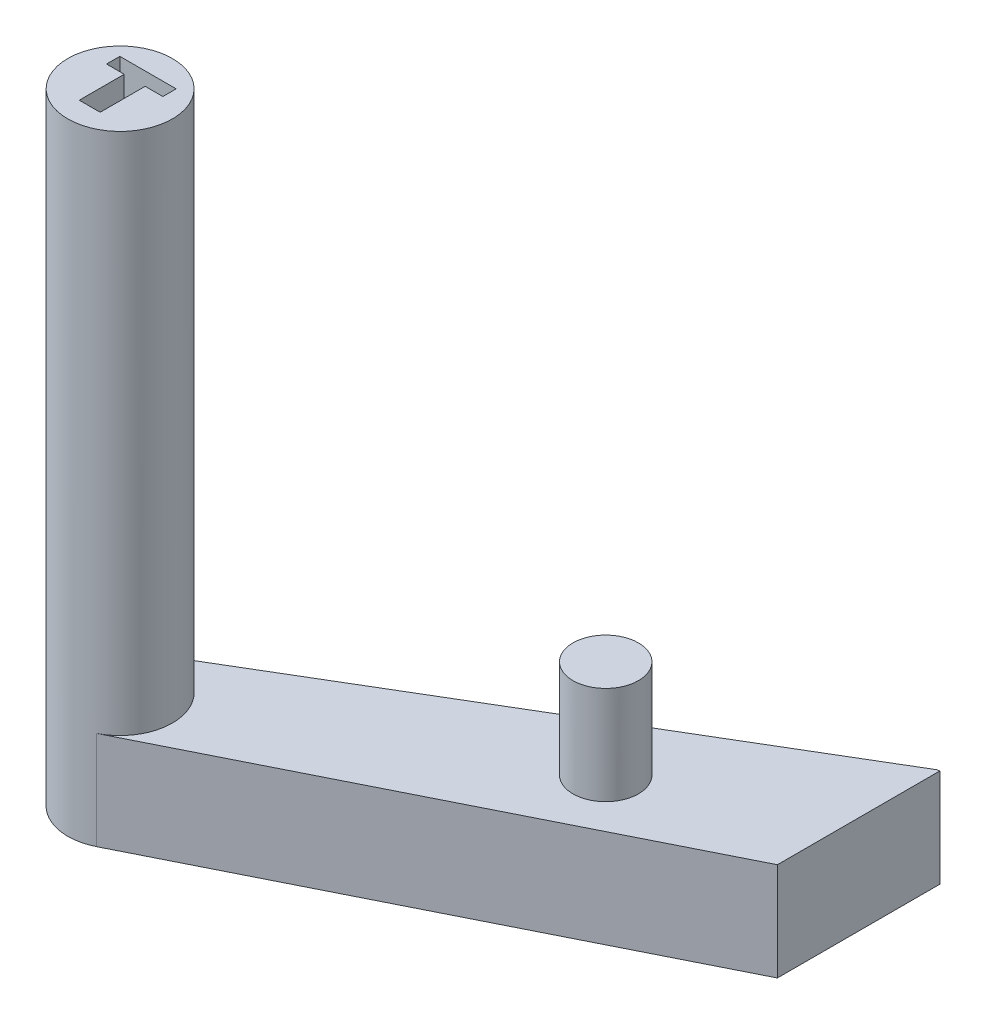
ISO-10303-21;
HEADER;
FILE_DESCRIPTION(('STEP AP214'),'2;1');
FILE_NAME('part.step','',(''),(''),'','','');
FILE_SCHEMA(('AUTOMOTIVE_DESIGN { 1 0 10303 214 1 1 1 1 }'));
ENDSEC;
DATA;
#1=APPLICATION_CONTEXT('core data for automotive mechanical design processes');
#2=APPLICATION_PROTOCOL_DEFINITION('international standard','automotive_design',2000,#1);
#3=PRODUCT_CONTEXT('',#1,'mechanical');
#4=PRODUCT('Part','Part','',(#3));
#5=PRODUCT_RELATED_PRODUCT_CATEGORY('part','',(#4));
#6=PRODUCT_DEFINITION_FORMATION('','',#4);
#7=PRODUCT_DEFINITION_CONTEXT('part definition',#1,'design');
#8=PRODUCT_DEFINITION('design','',#6,#7);
#9=PRODUCT_DEFINITION_SHAPE('','',#8);
#10=(LENGTH_UNIT() NAMED_UNIT(*) SI_UNIT(.MILLI.,.METRE.));
#11=(NAMED_UNIT(*) PLANE_ANGLE_UNIT() SI_UNIT($,.RADIAN.));
#12=(NAMED_UNIT(*) SI_UNIT($,.STERADIAN.) SOLID_ANGLE_UNIT());
#13=UNCERTAINTY_MEASURE_WITH_UNIT(LENGTH_MEASURE(1.E-05),#10,'distance_accuracy_value','');
#14=(GEOMETRIC_REPRESENTATION_CONTEXT(3) GLOBAL_UNCERTAINTY_ASSIGNED_CONTEXT((#13)) GLOBAL_UNIT_ASSIGNED_CONTEXT((#10,
#11,#12)) REPRESENTATION_CONTEXT('',''));
#15=CARTESIAN_POINT('',(0.,0.,0.));
#16=DIRECTION('',(0.,0.,1.));
#17=DIRECTION('',(1.,0.,0.));
#18=AXIS2_PLACEMENT_3D('',#15,#16,#17);
#19=CARTESIAN_POINT('',(0.,95.,0.));
#20=DIRECTION('',(0.,-1.,0.));
#21=DIRECTION('',(0.,0.,-1.));
#22=AXIS2_PLACEMENT_3D('',#19,#20,#21);
#23=CYLINDRICAL_SURFACE('',#22,8.);
#24=CARTESIAN_POINT('',(0.,95.,0.));
#25=DIRECTION('',(0.,1.,0.));
#26=DIRECTION('',(0.,0.,1.));
#27=AXIS2_PLACEMENT_3D('',#24,#25,#26);
#28=CIRCLE('',#27,8.);
#29=CARTESIAN_POINT('',(0.,95.,8.));
#30=VERTEX_POINT('',#29);
#31=EDGE_CURVE('E69',#30,#30,#28,.T.);
#32=ORIENTED_EDGE('',*,*,#31,.F.);
#33=EDGE_LOOP('',(#32));
#34=FACE_BOUND('',#33,.T.);
#35=DIRECTION('',(0.,-1.,0.));
#36=VECTOR('',#35,1.);
#37=CARTESIAN_POINT('',(3.57279106032632,15.,7.1578742681925));
#38=LINE('',#37,#36);
#39=CARTESIAN_POINT('',(3.57279106032632,15.,7.1578742681925));
#40=VERTEX_POINT('',#39);
#41=CARTESIAN_POINT('',(3.57279106032632,0.,7.1578742681925));
#42=VERTEX_POINT('',#41);
#43=EDGE_CURVE('E76',#40,#42,#38,.T.);
#44=ORIENTED_EDGE('',*,*,#43,.F.);
#45=CARTESIAN_POINT('',(0.,15.,0.));
#46=DIRECTION('',(0.,-1.,0.));
#47=DIRECTION('',(0.,0.,-1.));
#48=AXIS2_PLACEMENT_3D('',#45,#46,#47);
#49=CIRCLE('',#48,8.);
#50=CARTESIAN_POINT('',(-2.57513796478655,15.,-7.57421048442113));
#51=VERTEX_POINT('',#50);
#52=EDGE_CURVE('E80',#51,#40,#49,.T.);
#53=ORIENTED_EDGE('',*,*,#52,.F.);
#54=DIRECTION('',(0.,-1.,0.));
#55=VECTOR('',#54,1.);
#56=CARTESIAN_POINT('',(-2.57513796478655,15.,-7.57421048442113));
#57=LINE('',#56,#55);
#58=CARTESIAN_POINT('',(-2.57513796478655,0.,-7.57421048442113));
#59=VERTEX_POINT('',#58);
#60=EDGE_CURVE('E195',#51,#59,#57,.T.);
#61=ORIENTED_EDGE('',*,*,#60,.T.);
#62=CARTESIAN_POINT('',(0.,0.,0.));
#63=DIRECTION('',(0.,1.,0.));
#64=DIRECTION('',(0.,0.,1.));
#65=AXIS2_PLACEMENT_3D('',#62,#63,#64);
#66=CIRCLE('',#65,8.);
#67=EDGE_CURVE('E268',#59,#42,#66,.T.);
#68=ORIENTED_EDGE('',*,*,#67,.T.);
#69=EDGE_LOOP('',(#44,#53,#61,#68));
#70=FACE_BOUND('',#69,.T.);
#71=ADVANCED_FACE('F62',(#34,#70),#23,.T.);
#72=CARTESIAN_POINT('',(0.,95.,0.));
#73=DIRECTION('',(0.,1.,0.));
#74=DIRECTION('',(0.,0.,1.));
#75=AXIS2_PLACEMENT_3D('',#72,#73,#74);
#76=PLANE('',#75);
#77=DIRECTION('',(1.,0.,0.));
#78=VECTOR('',#77,1.);
#79=CARTESIAN_POINT('',(-4.30442583493273,95.,-2.23130289924676));
#80=LINE('',#79,#78);
#81=CARTESIAN_POINT('',(-4.30442583493273,95.,-2.23130289924676));
#82=VERTEX_POINT('',#81);
#83=CARTESIAN_POINT('',(-1.59808880377393,95.,-2.23130289924676));
#84=VERTEX_POINT('',#83);
#85=EDGE_CURVE('E253',#82,#84,#80,.T.);
#86=ORIENTED_EDGE('',*,*,#85,.F.);
#87=DIRECTION('',(0.,0.,1.));
#88=VECTOR('',#87,1.);
#89=CARTESIAN_POINT('',(-4.30442583493273,95.,-4.26644135995702));
#90=LINE('',#89,#88);
#91=CARTESIAN_POINT('',(-4.30442583493273,95.,-4.26644135995702));
#92=VERTEX_POINT('',#91);
#93=EDGE_CURVE('E236',#92,#82,#90,.T.);
#94=ORIENTED_EDGE('',*,*,#93,.F.);
#95=DIRECTION('',(1.,0.,0.));
#96=VECTOR('',#95,1.);
#97=CARTESIAN_POINT('',(-4.30442583493273,95.,-4.26644135995702));
#98=LINE('',#97,#96);
#99=CARTESIAN_POINT('',(4.30442583493273,95.,-4.26644135995702));
#100=VERTEX_POINT('',#99);
#101=EDGE_CURVE('E197',#92,#100,#98,.T.);
#102=ORIENTED_EDGE('',*,*,#101,.T.);
#103=DIRECTION('',(0.,0.,1.));
#104=VECTOR('',#103,1.);
#105=CARTESIAN_POINT('',(4.30442583493273,95.,-4.26644135995702));
#106=LINE('',#105,#104);
#107=CARTESIAN_POINT('',(4.30442583493273,95.,-2.23130289924676));
#108=VERTEX_POINT('',#107);
#109=EDGE_CURVE('E249',#100,#108,#106,.T.);
#110=ORIENTED_EDGE('',*,*,#109,.T.);
#111=CARTESIAN_POINT('',(1.59808880377393,95.,-2.23130289924676));
#112=VERTEX_POINT('',#111);
#113=EDGE_CURVE('E252',#112,#108,#80,.T.);
#114=ORIENTED_EDGE('',*,*,#113,.F.);
#115=DIRECTION('',(0.,0.,-1.));
#116=VECTOR('',#115,1.);
#117=CARTESIAN_POINT('',(1.59808880377393,95.,4.64408554655207));
#118=LINE('',#117,#116);
#119=CARTESIAN_POINT('',(1.59808880377393,95.,4.64408554655207));
#120=VERTEX_POINT('',#119);
#121=EDGE_CURVE('E218',#120,#112,#118,.T.);
#122=ORIENTED_EDGE('',*,*,#121,.F.);
#123=DIRECTION('',(1.,0.,0.));
#124=VECTOR('',#123,1.);
#125=CARTESIAN_POINT('',(-1.59808880377393,95.,4.64408554655207));
#126=LINE('',#125,#124);
#127=CARTESIAN_POINT('',(-1.59808880377393,95.,4.64408554655207));
#128=VERTEX_POINT('',#127);
#129=EDGE_CURVE('E208',#128,#120,#126,.T.);
#130=ORIENTED_EDGE('',*,*,#129,.F.);
#131=DIRECTION('',(0.,0.,-1.));
#132=VECTOR('',#131,1.);
#133=CARTESIAN_POINT('',(-1.59808880377393,95.,4.64408554655207));
#134=LINE('',#133,#132);
#135=EDGE_CURVE('E215',#128,#84,#134,.T.);
#136=ORIENTED_EDGE('',*,*,#135,.T.);
#137=EDGE_LOOP('',(#86,#94,#102,#110,#114,#122,#130,#136));
#138=FACE_BOUND('',#137,.T.);
#139=ORIENTED_EDGE('',*,*,#31,.T.);
#140=EDGE_LOOP('',(#139));
#141=FACE_BOUND('',#140,.T.);
#142=ADVANCED_FACE('F303',(#138,#141),#76,.T.);
#143=CARTESIAN_POINT('',(0.,0.,0.));
#144=DIRECTION('',(0.,1.,0.));
#145=DIRECTION('',(0.,0.,1.));
#146=AXIS2_PLACEMENT_3D('',#143,#144,#145);
#147=PLANE('',#146);
#148=CARTESIAN_POINT('',(0.,0.,0.));
#149=DIRECTION('',(0.,-1.,0.));
#150=DIRECTION('',(0.,0.,-1.));
#151=AXIS2_PLACEMENT_3D('',#148,#149,#150);
#152=CIRCLE('',#151,4.);
#153=CARTESIAN_POINT('',(0.,0.,-4.));
#154=VERTEX_POINT('',#153);
#155=EDGE_CURVE('E231',#154,#154,#152,.T.);
#156=ORIENTED_EDGE('',*,*,#155,.F.);
#157=EDGE_LOOP('',(#156));
#158=FACE_BOUND('',#157,.T.);
#159=ORIENTED_EDGE('',*,*,#67,.F.);
#160=DIRECTION('',(-0.859611158963441,0.,0.510948779610568));
#161=VECTOR('',#160,1.);
#162=CARTESIAN_POINT('',(-3.99901187705569,0.,-6.72786661113949));
#163=LINE('',#162,#161);
#164=CARTESIAN_POINT('',(72.6147453803107,0.,-52.2667191072324));
#165=VERTEX_POINT('',#164);
#166=EDGE_CURVE('E168',#165,#59,#163,.T.);
#167=ORIENTED_EDGE('',*,*,#166,.F.);
#168=CARTESIAN_POINT('',(75.0017361381057,0.,-39.9967445709018));
#169=DIRECTION('',(0.,-1.,0.));
#170=DIRECTION('',(0.,0.,-1.));
#171=AXIS2_PLACEMENT_3D('',#168,#169,#170);
#172=CIRCLE('',#171,12.5);
#173=CARTESIAN_POINT('',(73.0017361381057,0.,-52.3357072501549));
#174=VERTEX_POINT('',#173);
#175=EDGE_CURVE('E187',#165,#174,#172,.T.);
#176=ORIENTED_EDGE('',*,*,#175,.T.);
#177=DIRECTION('',(0.,0.,1.));
#178=VECTOR('',#177,1.);
#179=CARTESIAN_POINT('',(73.0017361381057,0.,0.));
#180=LINE('',#179,#178);
#181=CARTESIAN_POINT('',(73.0017361381057,0.,-27.4967445709018));
#182=VERTEX_POINT('',#181);
#183=EDGE_CURVE('E190',#174,#182,#180,.T.);
#184=ORIENTED_EDGE('',*,*,#183,.T.);
#185=DIRECTION('',(-0.894735513611201,0.,0.446596418125919));
#186=VECTOR('',#185,1.);
#187=CARTESIAN_POINT('',(3.5727713449938,0.,7.15788410886245));
#188=LINE('',#187,#186);
#189=EDGE_CURVE('E174',#182,#42,#188,.T.);
#190=ORIENTED_EDGE('',*,*,#189,.T.);
#191=EDGE_LOOP('',(#159,#167,#176,#184,#190));
#192=FACE_BOUND('',#191,.T.);
#193=ADVANCED_FACE('F277',(#158,#192),#147,.F.);
#194=CARTESIAN_POINT('',(0.,45.,0.));
#195=DIRECTION('',(0.,-1.,0.));
#196=DIRECTION('',(0.,0.,-1.));
#197=AXIS2_PLACEMENT_3D('',#194,#195,#196);
#198=CYLINDRICAL_SURFACE('',#197,4.);
#199=CARTESIAN_POINT('',(0.,45.,0.));
#200=DIRECTION('',(0.,-1.,0.));
#201=DIRECTION('',(0.,0.,-1.));
#202=AXIS2_PLACEMENT_3D('',#199,#200,#201);
#203=CIRCLE('',#202,4.);
#204=CARTESIAN_POINT('',(0.,45.,-4.));
#205=VERTEX_POINT('',#204);
#206=EDGE_CURVE('E163',#205,#205,#203,.T.);
#207=CARTESIAN_POINT('',(0.,45.,-4.));
#208=CARTESIAN_POINT('',(0.,44.53125,-4.));
#209=CARTESIAN_POINT('',(0.,44.0625,-4.));
#210=CARTESIAN_POINT('',(0.,43.125,-4.));
#211=CARTESIAN_POINT('',(0.,42.65625,-4.));
#212=CARTESIAN_POINT('',(0.,41.71875,-4.));
#213=CARTESIAN_POINT('',(0.,41.25,-4.));
#214=CARTESIAN_POINT('',(0.,40.3125,-4.));
#215=CARTESIAN_POINT('',(0.,39.84375,-4.));
#216=CARTESIAN_POINT('',(0.,38.90625,-4.));
#217=CARTESIAN_POINT('',(0.,38.4375,-4.));
#218=CARTESIAN_POINT('',(0.,37.5,-4.));
#219=CARTESIAN_POINT('',(0.,37.03125,-4.));
#220=CARTESIAN_POINT('',(0.,36.09375,-4.));
#221=CARTESIAN_POINT('',(0.,35.625,-4.));
#222=CARTESIAN_POINT('',(0.,34.6875,-4.));
#223=CARTESIAN_POINT('',(0.,34.21875,-4.));
#224=CARTESIAN_POINT('',(0.,33.28125,-4.));
#225=CARTESIAN_POINT('',(0.,32.8125,-4.));
#226=CARTESIAN_POINT('',(0.,31.875,-4.));
#227=CARTESIAN_POINT('',(0.,31.40625,-4.));
#228=CARTESIAN_POINT('',(0.,30.46875,-4.));
#229=CARTESIAN_POINT('',(0.,30.,-4.));
#230=CARTESIAN_POINT('',(0.,29.0625,-4.));
#231=CARTESIAN_POINT('',(0.,28.59375,-4.));
#232=CARTESIAN_POINT('',(0.,27.65625,-4.));
#233=CARTESIAN_POINT('',(0.,27.1875,-4.));
#234=CARTESIAN_POINT('',(0.,26.25,-4.));
#235=CARTESIAN_POINT('',(0.,25.78125,-4.));
#236=CARTESIAN_POINT('',(0.,24.84375,-4.));
#237=CARTESIAN_POINT('',(0.,24.375,-4.));
#238=CARTESIAN_POINT('',(0.,23.4375,-4.));
#239=CARTESIAN_POINT('',(0.,22.96875,-4.));
#240=CARTESIAN_POINT('',(0.,22.03125,-4.));
#241=CARTESIAN_POINT('',(0.,21.5625,-4.));
#242=CARTESIAN_POINT('',(0.,20.625,-4.));
#243=CARTESIAN_POINT('',(0.,20.15625,-4.));
#244=CARTESIAN_POINT('',(0.,19.21875,-4.));
#245=CARTESIAN_POINT('',(0.,18.75,-4.));
#246=CARTESIAN_POINT('',(0.,17.8125,-4.));
#247=CARTESIAN_POINT('',(0.,17.34375,-4.));
#248=CARTESIAN_POINT('',(0.,16.40625,-4.));
#249=CARTESIAN_POINT('',(0.,15.9375,-4.));
#250=CARTESIAN_POINT('',(0.,15.,-4.));
#251=CARTESIAN_POINT('',(0.,14.53125,-4.));
#252=CARTESIAN_POINT('',(0.,13.59375,-4.));
#253=CARTESIAN_POINT('',(0.,13.125,-4.));
#254=CARTESIAN_POINT('',(0.,12.1875,-4.));
#255=CARTESIAN_POINT('',(0.,11.71875,-4.));
#256=CARTESIAN_POINT('',(0.,10.78125,-4.));
#257=CARTESIAN_POINT('',(0.,10.3125,-4.));
#258=CARTESIAN_POINT('',(0.,9.37500000000001,-4.));
#259=CARTESIAN_POINT('',(0.,8.90625000000001,-4.));
#260=CARTESIAN_POINT('',(0.,7.96875000000001,-4.));
#261=CARTESIAN_POINT('',(0.,7.5,-4.));
#262=CARTESIAN_POINT('',(0.,6.5625,-4.));
#263=CARTESIAN_POINT('',(0.,6.09375,-4.));
#264=CARTESIAN_POINT('',(0.,5.15625000000001,-4.));
#265=CARTESIAN_POINT('',(0.,4.68750000000001,-4.));
#266=CARTESIAN_POINT('',(0.,3.75000000000001,-4.));
#267=CARTESIAN_POINT('',(0.,3.28125000000001,-4.));
#268=CARTESIAN_POINT('',(0.,2.34375000000001,-4.));
#269=CARTESIAN_POINT('',(0.,1.87500000000001,-4.));
#270=CARTESIAN_POINT('',(0.,0.937500000000006,-4.));
#271=CARTESIAN_POINT('',(0.,0.468750000000007,-4.));
#272=CARTESIAN_POINT('',(0.,0.,-4.));
#273=B_SPLINE_CURVE_WITH_KNOTS('',3,(#207,#208,#209,#210,#211,#212,#213,#214,#215,#216,#217,
#218,#219,#220,#221,#222,#223,#224,#225,#226,#227,#228,#229,#230,#231,#232,#233,#234,#235,#236,
#237,#238,#239,#240,#241,#242,#243,#244,#245,#246,#247,#248,#249,#250,#251,#252,#253,#254,#255,
#256,#257,#258,#259,#260,#261,#262,#263,#264,#265,#266,#267,#268,#269,#270,#271,#272),
.UNSPECIFIED.,.F.,.F.,(4,2,2,2,2,2,2,2,2,2,2,2,2,2,2,2,2,2,2,2,2,2,2,2,2,2,2,2,2,2,2,2,4),(0.,
1.40625,2.8125,4.21874999999999,5.625,7.03125,8.43749999999999,9.84374999999999,11.25,12.65625,
14.0625,15.46875,16.875,18.28125,19.6875,21.09375,22.5,23.90625,25.3125,26.71875,28.125,
29.53125,30.9375,32.34375,33.75,35.15625,36.5625,37.96875,39.375,40.78125,42.1875,43.59375,45.),.UNSPECIFIED.);
#274=EDGE_CURVE('BSEAM315',#205,#154,#273,.T.);
#275=ORIENTED_EDGE('',*,*,#206,.F.);
#276=ORIENTED_EDGE('',*,*,#155,.T.);
#277=ORIENTED_EDGE('',*,*,#274,.T.);
#278=ORIENTED_EDGE('',*,*,#274,.F.);
#279=EDGE_LOOP('',(#275,#277,#276,#278));
#280=FACE_BOUND('',#279,.T.);
#281=ADVANCED_FACE('F315',(#280),#198,.F.);
#282=CARTESIAN_POINT('',(-1.59808880377393,55.,4.64408554655207));
#283=DIRECTION('',(1.,0.,0.));
#284=DIRECTION('',(0.,0.,-1.));
#285=AXIS2_PLACEMENT_3D('',#282,#283,#284);
#286=PLANE('',#285);
#287=ORIENTED_EDGE('',*,*,#135,.F.);
#288=DIRECTION('',(0.,1.,0.));
#289=VECTOR('',#288,1.);
#290=CARTESIAN_POINT('',(-1.59808880377393,55.,4.64408554655207));
#291=LINE('',#290,#289);
#292=CARTESIAN_POINT('',(-1.59808880377393,55.,4.64408554655207));
#293=VERTEX_POINT('',#292);
#294=EDGE_CURVE('E214',#293,#128,#291,.T.);
#295=ORIENTED_EDGE('',*,*,#294,.F.);
#296=DIRECTION('',(0.,0.,-1.));
#297=VECTOR('',#296,1.);
#298=CARTESIAN_POINT('',(-1.59808880377393,55.,4.64408554655207));
#299=LINE('',#298,#297);
#300=CARTESIAN_POINT('',(-1.59808880377393,55.,-2.23130289924676));
#301=VERTEX_POINT('',#300);
#302=EDGE_CURVE('E204',#293,#301,#299,.T.);
#303=ORIENTED_EDGE('',*,*,#302,.T.);
#304=DIRECTION('',(0.,1.,0.));
#305=VECTOR('',#304,1.);
#306=CARTESIAN_POINT('',(-1.59808880377393,55.,-2.23130289924676));
#307=LINE('',#306,#305);
#308=EDGE_CURVE('E229',#301,#84,#307,.T.);
#309=ORIENTED_EDGE('',*,*,#308,.T.);
#310=EDGE_LOOP('',(#287,#295,#303,#309));
#311=FACE_BOUND('',#310,.T.);
#312=ADVANCED_FACE('F321',(#311),#286,.T.);
#313=CARTESIAN_POINT('',(1.59808880377393,55.,4.64408554655207));
#314=DIRECTION('',(1.,0.,0.));
#315=DIRECTION('',(0.,0.,-1.));
#316=AXIS2_PLACEMENT_3D('',#313,#314,#315);
#317=PLANE('',#316);
#318=ORIENTED_EDGE('',*,*,#121,.T.);
#319=DIRECTION('',(0.,1.,0.));
#320=VECTOR('',#319,1.);
#321=CARTESIAN_POINT('',(1.59808880377393,55.,-2.23130289924676));
#322=LINE('',#321,#320);
#323=CARTESIAN_POINT('',(1.59808880377393,55.,-2.23130289924676));
#324=VERTEX_POINT('',#323);
#325=EDGE_CURVE('E226',#324,#112,#322,.T.);
#326=ORIENTED_EDGE('',*,*,#325,.F.);
#327=DIRECTION('',(0.,0.,-1.));
#328=VECTOR('',#327,1.);
#329=CARTESIAN_POINT('',(1.59808880377393,55.,4.64408554655207));
#330=LINE('',#329,#328);
#331=CARTESIAN_POINT('',(1.59808880377393,55.,4.64408554655207));
#332=VERTEX_POINT('',#331);
#333=EDGE_CURVE('E207',#332,#324,#330,.T.);
#334=ORIENTED_EDGE('',*,*,#333,.F.);
#335=DIRECTION('',(0.,1.,0.));
#336=VECTOR('',#335,1.);
#337=CARTESIAN_POINT('',(1.59808880377393,55.,4.64408554655207));
#338=LINE('',#337,#336);
#339=EDGE_CURVE('E224',#332,#120,#338,.T.);
#340=ORIENTED_EDGE('',*,*,#339,.T.);
#341=EDGE_LOOP('',(#318,#326,#334,#340));
#342=FACE_BOUND('',#341,.T.);
#343=ADVANCED_FACE('F342',(#342),#317,.F.);
#344=CARTESIAN_POINT('',(-1.59808880377393,55.,4.64408554655207));
#345=DIRECTION('',(0.,0.,1.));
#346=DIRECTION('',(1.,0.,0.));
#347=AXIS2_PLACEMENT_3D('',#344,#345,#346);
#348=PLANE('',#347);
#349=ORIENTED_EDGE('',*,*,#129,.T.);
#350=ORIENTED_EDGE('',*,*,#339,.F.);
#351=DIRECTION('',(1.,0.,0.));
#352=VECTOR('',#351,1.);
#353=CARTESIAN_POINT('',(-1.59808880377393,55.,4.64408554655207));
#354=LINE('',#353,#352);
#355=EDGE_CURVE('E211',#293,#332,#354,.T.);
#356=ORIENTED_EDGE('',*,*,#355,.F.);
#357=ORIENTED_EDGE('',*,*,#294,.T.);
#358=EDGE_LOOP('',(#349,#350,#356,#357));
#359=FACE_BOUND('',#358,.T.);
#360=ADVANCED_FACE('F346',(#359),#348,.F.);
#361=CARTESIAN_POINT('',(0.,55.,0.));
#362=DIRECTION('',(0.,-1.,0.));
#363=DIRECTION('',(0.,0.,-1.));
#364=AXIS2_PLACEMENT_3D('',#361,#362,#363);
#365=PLANE('',#364);
#366=ORIENTED_EDGE('',*,*,#302,.F.);
#367=ORIENTED_EDGE('',*,*,#355,.T.);
#368=ORIENTED_EDGE('',*,*,#333,.T.);
#369=DIRECTION('',(1.,0.,0.));
#370=VECTOR('',#369,1.);
#371=CARTESIAN_POINT('',(-4.30442583493273,55.,-2.23130289924676));
#372=LINE('',#371,#370);
#373=CARTESIAN_POINT('',(4.30442583493273,55.,-2.23130289924676));
#374=VERTEX_POINT('',#373);
#375=EDGE_CURVE('E239',#324,#374,#372,.T.);
#376=ORIENTED_EDGE('',*,*,#375,.T.);
#377=DIRECTION('',(0.,0.,1.));
#378=VECTOR('',#377,1.);
#379=CARTESIAN_POINT('',(4.30442583493273,55.,-4.26644135995702));
#380=LINE('',#379,#378);
#381=CARTESIAN_POINT('',(4.30442583493273,55.,-4.26644135995702));
#382=VERTEX_POINT('',#381);
#383=EDGE_CURVE('E235',#382,#374,#380,.T.);
#384=ORIENTED_EDGE('',*,*,#383,.F.);
#385=DIRECTION('',(1.,0.,0.));
#386=VECTOR('',#385,1.);
#387=CARTESIAN_POINT('',(-4.30442583493273,55.,-4.26644135995702));
#388=LINE('',#387,#386);
#389=CARTESIAN_POINT('',(-4.30442583493273,55.,-4.26644135995702));
#390=VERTEX_POINT('',#389);
#391=EDGE_CURVE('E232',#390,#382,#388,.T.);
#392=ORIENTED_EDGE('',*,*,#391,.F.);
#393=DIRECTION('',(0.,0.,1.));
#394=VECTOR('',#393,1.);
#395=CARTESIAN_POINT('',(-4.30442583493273,55.,-4.26644135995702));
#396=LINE('',#395,#394);
#397=CARTESIAN_POINT('',(-4.30442583493273,55.,-2.23130289924676));
#398=VERTEX_POINT('',#397);
#399=EDGE_CURVE('E243',#390,#398,#396,.T.);
#400=ORIENTED_EDGE('',*,*,#399,.T.);
#401=EDGE_CURVE('E240',#398,#301,#372,.T.);
#402=ORIENTED_EDGE('',*,*,#401,.T.);
#403=EDGE_LOOP('',(#366,#367,#368,#376,#384,#392,#400,#402));
#404=FACE_BOUND('',#403,.T.);
#405=ADVANCED_FACE('F327',(#404),#365,.F.);
#406=CARTESIAN_POINT('',(-4.30442583493273,55.,-4.26644135995702));
#407=DIRECTION('',(0.,0.,1.));
#408=DIRECTION('',(1.,0.,0.));
#409=AXIS2_PLACEMENT_3D('',#406,#407,#408);
#410=PLANE('',#409);
#411=ORIENTED_EDGE('',*,*,#101,.F.);
#412=DIRECTION('',(0.,1.,0.));
#413=VECTOR('',#412,1.);
#414=CARTESIAN_POINT('',(-4.30442583493273,55.,-4.26644135995702));
#415=LINE('',#414,#413);
#416=EDGE_CURVE('E246',#390,#92,#415,.T.);
#417=ORIENTED_EDGE('',*,*,#416,.F.);
#418=ORIENTED_EDGE('',*,*,#391,.T.);
#419=DIRECTION('',(0.,1.,0.));
#420=VECTOR('',#419,1.);
#421=CARTESIAN_POINT('',(4.30442583493273,55.,-4.26644135995702));
#422=LINE('',#421,#420);
#423=EDGE_CURVE('E219',#382,#100,#422,.T.);
#424=ORIENTED_EDGE('',*,*,#423,.T.);
#425=EDGE_LOOP('',(#411,#417,#418,#424));
#426=FACE_BOUND('',#425,.T.);
#427=ADVANCED_FACE('F323',(#426),#410,.T.);
#428=CARTESIAN_POINT('',(4.30442583493273,55.,-4.26644135995702));
#429=DIRECTION('',(-1.,0.,0.));
#430=DIRECTION('',(0.,0.,1.));
#431=AXIS2_PLACEMENT_3D('',#428,#429,#430);
#432=PLANE('',#431);
#433=ORIENTED_EDGE('',*,*,#109,.F.);
#434=ORIENTED_EDGE('',*,*,#423,.F.);
#435=ORIENTED_EDGE('',*,*,#383,.T.);
#436=DIRECTION('',(0.,1.,0.));
#437=VECTOR('',#436,1.);
#438=CARTESIAN_POINT('',(4.30442583493273,55.,-2.23130289924676));
#439=LINE('',#438,#437);
#440=EDGE_CURVE('E261',#374,#108,#439,.T.);
#441=ORIENTED_EDGE('',*,*,#440,.T.);
#442=EDGE_LOOP('',(#433,#434,#435,#441));
#443=FACE_BOUND('',#442,.T.);
#444=ADVANCED_FACE('F326',(#443),#432,.T.);
#445=CARTESIAN_POINT('',(-4.30442583493273,55.,-4.26644135995702));
#446=DIRECTION('',(-1.,0.,0.));
#447=DIRECTION('',(0.,0.,1.));
#448=AXIS2_PLACEMENT_3D('',#445,#446,#447);
#449=PLANE('',#448);
#450=ORIENTED_EDGE('',*,*,#93,.T.);
#451=DIRECTION('',(0.,1.,0.));
#452=VECTOR('',#451,1.);
#453=CARTESIAN_POINT('',(-4.30442583493273,55.,-2.23130289924676));
#454=LINE('',#453,#452);
#455=EDGE_CURVE('E259',#398,#82,#454,.T.);
#456=ORIENTED_EDGE('',*,*,#455,.F.);
#457=ORIENTED_EDGE('',*,*,#399,.F.);
#458=ORIENTED_EDGE('',*,*,#416,.T.);
#459=EDGE_LOOP('',(#450,#456,#457,#458));
#460=FACE_BOUND('',#459,.T.);
#461=ADVANCED_FACE('F331',(#460),#449,.F.);
#462=CARTESIAN_POINT('',(-4.30442583493273,55.,-2.23130289924676));
#463=DIRECTION('',(0.,0.,1.));
#464=DIRECTION('',(1.,0.,0.));
#465=AXIS2_PLACEMENT_3D('',#462,#463,#464);
#466=PLANE('',#465);
#467=ORIENTED_EDGE('',*,*,#401,.F.);
#468=ORIENTED_EDGE('',*,*,#455,.T.);
#469=ORIENTED_EDGE('',*,*,#85,.T.);
#470=ORIENTED_EDGE('',*,*,#308,.F.);
#471=EDGE_LOOP('',(#467,#468,#469,#470));
#472=FACE_BOUND('',#471,.T.);
#473=ADVANCED_FACE('F333',(#472),#466,.F.);
#474=ORIENTED_EDGE('',*,*,#325,.T.);
#475=ORIENTED_EDGE('',*,*,#113,.T.);
#476=ORIENTED_EDGE('',*,*,#440,.F.);
#477=ORIENTED_EDGE('',*,*,#375,.F.);
#478=EDGE_LOOP('',(#474,#475,#476,#477));
#479=FACE_BOUND('',#478,.T.);
#480=ADVANCED_FACE('F322',(#479),#466,.F.);
#481=CARTESIAN_POINT('',(-3.99901187705569,15.,-6.72786661113949));
#482=DIRECTION('',(0.510948779610568,0.,0.859611158963441));
#483=DIRECTION('',(0.859611158963441,0.,-0.510948779610568));
#484=AXIS2_PLACEMENT_3D('',#481,#482,#483);
#485=PLANE('',#484);
#486=ORIENTED_EDGE('',*,*,#166,.T.);
#487=ORIENTED_EDGE('',*,*,#60,.F.);
#488=DIRECTION('',(-0.859611158963441,0.,0.510948779610568));
#489=VECTOR('',#488,1.);
#490=CARTESIAN_POINT('',(-3.99901187705569,15.,-6.72786661113949));
#491=LINE('',#490,#489);
#492=CARTESIAN_POINT('',(72.6147453803107,15.,-52.2667191072324));
#493=VERTEX_POINT('',#492);
#494=EDGE_CURVE('E171',#493,#51,#491,.T.);
#495=ORIENTED_EDGE('',*,*,#494,.F.);
#496=DIRECTION('',(0.,-1.,0.));
#497=VECTOR('',#496,1.);
#498=CARTESIAN_POINT('',(72.6147453803107,15.,-52.2667191072324));
#499=LINE('',#498,#497);
#500=EDGE_CURVE('E184',#493,#165,#499,.T.);
#501=ORIENTED_EDGE('',*,*,#500,.T.);
#502=EDGE_LOOP('',(#486,#487,#495,#501));
#503=FACE_BOUND('',#502,.T.);
#504=ADVANCED_FACE('F288',(#503),#485,.F.);
#505=CARTESIAN_POINT('',(3.5727713449938,15.,7.15788410886245));
#506=DIRECTION('',(0.446596418125919,0.,0.894735513611201));
#507=DIRECTION('',(0.894735513611201,0.,-0.446596418125919));
#508=AXIS2_PLACEMENT_3D('',#505,#506,#507);
#509=PLANE('',#508);
#510=ORIENTED_EDGE('',*,*,#189,.F.);
#511=DIRECTION('',(0.,-1.,0.));
#512=VECTOR('',#511,1.);
#513=CARTESIAN_POINT('',(73.0017361381057,15.,-27.4967445709018));
#514=LINE('',#513,#512);
#515=CARTESIAN_POINT('',(73.0017361381057,15.,-27.4967445709018));
#516=VERTEX_POINT('',#515);
#517=EDGE_CURVE('E199',#516,#182,#514,.T.);
#518=ORIENTED_EDGE('',*,*,#517,.F.);
#519=DIRECTION('',(-0.894735513611201,0.,0.446596418125919));
#520=VECTOR('',#519,1.);
#521=CARTESIAN_POINT('',(3.5727713449938,15.,7.15788410886245));
#522=LINE('',#521,#520);
#523=EDGE_CURVE('E180',#516,#40,#522,.T.);
#524=ORIENTED_EDGE('',*,*,#523,.T.);
#525=ORIENTED_EDGE('',*,*,#43,.T.);
#526=EDGE_LOOP('',(#510,#518,#524,#525));
#527=FACE_BOUND('',#526,.T.);
#528=ADVANCED_FACE('F275',(#527),#509,.T.);
#529=CARTESIAN_POINT('',(73.0017361381057,15.,0.));
#530=DIRECTION('',(1.,0.,0.));
#531=DIRECTION('',(0.,0.,-1.));
#532=AXIS2_PLACEMENT_3D('',#529,#530,#531);
#533=PLANE('',#532);
#534=ORIENTED_EDGE('',*,*,#183,.F.);
#535=DIRECTION('',(0.,-1.,0.));
#536=VECTOR('',#535,1.);
#537=CARTESIAN_POINT('',(73.0017361381057,15.,-52.3357072501549));
#538=LINE('',#537,#536);
#539=CARTESIAN_POINT('',(73.0017361381057,15.,-52.3357072501549));
#540=VERTEX_POINT('',#539);
#541=EDGE_CURVE('E201',#540,#174,#538,.T.);
#542=ORIENTED_EDGE('',*,*,#541,.F.);
#543=DIRECTION('',(0.,0.,1.));
#544=VECTOR('',#543,1.);
#545=CARTESIAN_POINT('',(73.0017361381057,15.,0.));
#546=LINE('',#545,#544);
#547=EDGE_CURVE('E177',#540,#516,#546,.T.);
#548=ORIENTED_EDGE('',*,*,#547,.T.);
#549=ORIENTED_EDGE('',*,*,#517,.T.);
#550=EDGE_LOOP('',(#534,#542,#548,#549));
#551=FACE_BOUND('',#550,.T.);
#552=ADVANCED_FACE('F281',(#551),#533,.T.);
#553=CARTESIAN_POINT('',(75.0017361381057,15.,-39.9967445709018));
#554=DIRECTION('',(0.,-1.,0.));
#555=DIRECTION('',(0.,0.,-1.));
#556=AXIS2_PLACEMENT_3D('',#553,#554,#555);
#557=CYLINDRICAL_SURFACE('',#556,12.5);
#558=ORIENTED_EDGE('',*,*,#175,.F.);
#559=ORIENTED_EDGE('',*,*,#500,.F.);
#560=CARTESIAN_POINT('',(75.0017361381057,15.,-39.9967445709018));
#561=DIRECTION('',(0.,-1.,0.));
#562=DIRECTION('',(0.,0.,-1.));
#563=AXIS2_PLACEMENT_3D('',#560,#561,#562);
#564=CIRCLE('',#563,12.5);
#565=EDGE_CURVE('E173',#493,#540,#564,.T.);
#566=ORIENTED_EDGE('',*,*,#565,.T.);
#567=ORIENTED_EDGE('',*,*,#541,.T.);
#568=EDGE_LOOP('',(#558,#559,#566,#567));
#569=FACE_BOUND('',#568,.T.);
#570=ADVANCED_FACE('F290',(#569),#557,.T.);
#571=CARTESIAN_POINT('',(0.,15.,0.));
#572=DIRECTION('',(0.,-1.,0.));
#573=DIRECTION('',(0.,0.,-1.));
#574=AXIS2_PLACEMENT_3D('',#571,#572,#573);
#575=PLANE('',#574);
#576=CARTESIAN_POINT('',(48.0017361381057,15.,-26.2466106307581));
#577=DIRECTION('',(0.,-1.,0.));
#578=DIRECTION('',(0.,0.,-1.));
#579=AXIS2_PLACEMENT_3D('',#576,#577,#578);
#580=CIRCLE('',#579,5.);
#581=CARTESIAN_POINT('',(48.0017361381057,15.,-31.2466106307581));
#582=VERTEX_POINT('',#581);
#583=EDGE_CURVE('E12',#582,#582,#580,.F.);
#584=ORIENTED_EDGE('',*,*,#583,.F.);
#585=EDGE_LOOP('',(#584));
#586=FACE_BOUND('',#585,.T.);
#587=ORIENTED_EDGE('',*,*,#494,.T.);
#588=ORIENTED_EDGE('',*,*,#52,.T.);
#589=ORIENTED_EDGE('',*,*,#523,.F.);
#590=ORIENTED_EDGE('',*,*,#547,.F.);
#591=ORIENTED_EDGE('',*,*,#565,.F.);
#592=EDGE_LOOP('',(#587,#588,#589,#590,#591));
#593=FACE_BOUND('',#592,.T.);
#594=ADVANCED_FACE('F284',(#586,#593),#575,.F.);
#595=CARTESIAN_POINT('',(48.0017361381057,30.,-26.2466106307581));
#596=DIRECTION('',(0.,-1.,0.));
#597=DIRECTION('',(0.,0.,-1.));
#598=AXIS2_PLACEMENT_3D('',#595,#596,#597);
#599=CYLINDRICAL_SURFACE('',#598,5.);
#600=CARTESIAN_POINT('',(48.0017361381057,30.,-26.2466106307581));
#601=DIRECTION('',(0.,1.,0.));
#602=DIRECTION('',(0.,0.,1.));
#603=AXIS2_PLACEMENT_3D('',#600,#601,#602);
#604=CIRCLE('',#603,5.);
#605=CARTESIAN_POINT('',(48.0017361381057,30.,-21.2466106307581));
#606=VERTEX_POINT('',#605);
#607=EDGE_CURVE('E165',#606,#606,#604,.T.);
#608=ORIENTED_EDGE('',*,*,#607,.F.);
#609=EDGE_LOOP('',(#608));
#610=FACE_BOUND('',#609,.T.);
#611=ORIENTED_EDGE('',*,*,#583,.T.);
#612=EDGE_LOOP('',(#611));
#613=FACE_BOUND('',#612,.T.);
#614=ADVANCED_FACE('F297',(#610,#613),#599,.T.);
#615=CARTESIAN_POINT('',(0.,30.,0.));
#616=DIRECTION('',(0.,1.,0.));
#617=DIRECTION('',(0.,0.,1.));
#618=AXIS2_PLACEMENT_3D('',#615,#616,#617);
#619=PLANE('',#618);
#620=ORIENTED_EDGE('',*,*,#607,.T.);
#621=EDGE_LOOP('',(#620));
#622=FACE_BOUND('',#621,.T.);
#623=ADVANCED_FACE('F159',(#622),#619,.T.);
#624=CARTESIAN_POINT('',(0.,45.,0.));
#625=DIRECTION('',(0.,-1.,0.));
#626=DIRECTION('',(0.,0.,-1.));
#627=AXIS2_PLACEMENT_3D('',#624,#625,#626);
#628=CONICAL_SURFACE('',#627,4.,0.523598775598293);
#629=CARTESIAN_POINT('',(0.,51.9282032302756,0.));
#630=VERTEX_POINT('',#629);
#631=VERTEX_LOOP('',#630);
#632=FACE_BOUND('',#631,.T.);
#633=ORIENTED_EDGE('',*,*,#206,.T.);
#634=EDGE_LOOP('',(#633));
#635=FACE_BOUND('',#634,.T.);
#636=ADVANCED_FACE('F156',(#632,#635),#628,.F.);
#637=CLOSED_SHELL('',(#71,#142,#193,#281,#312,#343,#360,#405,#427,#444,#461,#473,#480,#504,#528,
#552,#570,#594,#614,#623,#636));
#638=MANIFOLD_SOLID_BREP('B2',#637);
#639=ADVANCED_BREP_SHAPE_REPRESENTATION('',(#18,#638),#14);
#640=SHAPE_DEFINITION_REPRESENTATION(#9,#639);
ENDSEC;
END-ISO-10303-21;
